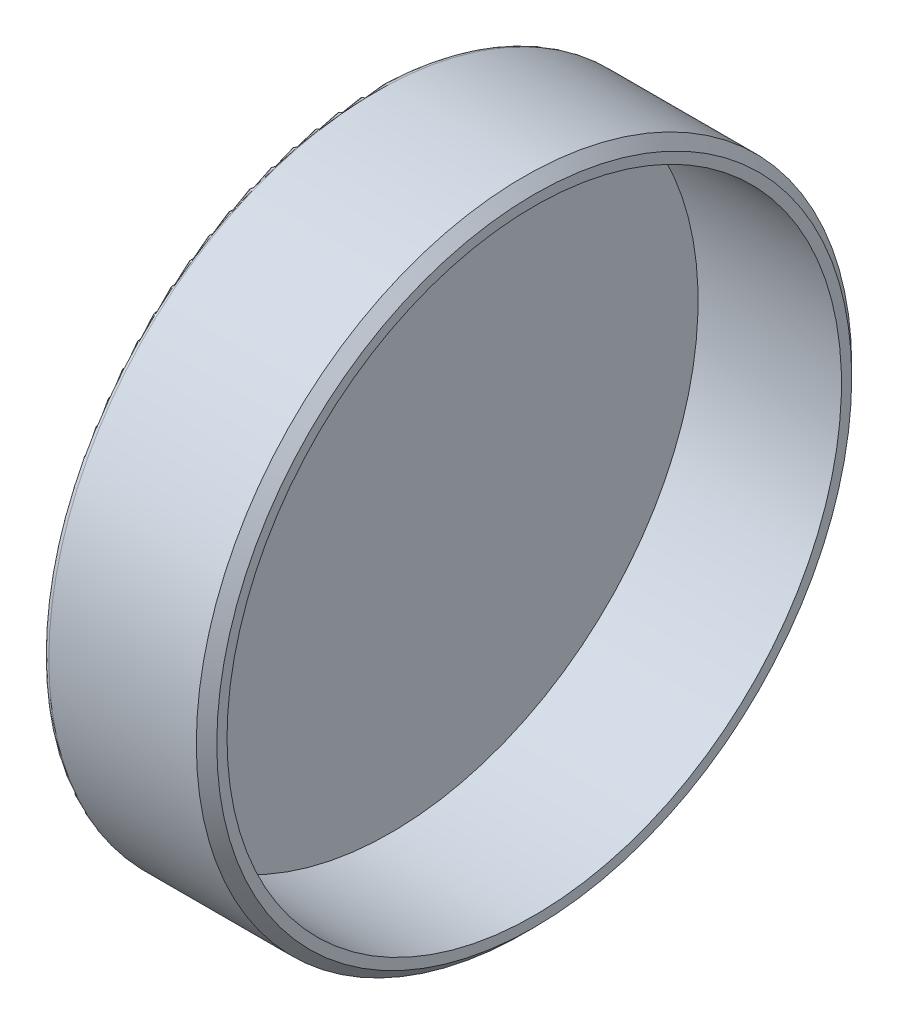
ISO-10303-21;
HEADER;
FILE_DESCRIPTION(('STEP AP214'),'2;1');
FILE_NAME('part.step','',(''),(''),'','','');
FILE_SCHEMA(('AUTOMOTIVE_DESIGN { 1 0 10303 214 1 1 1 1 }'));
ENDSEC;
DATA;
#1=APPLICATION_CONTEXT('core data for automotive mechanical design processes');
#2=APPLICATION_PROTOCOL_DEFINITION('international standard','automotive_design',2000,#1);
#3=PRODUCT_CONTEXT('',#1,'mechanical');
#4=PRODUCT('Part','Part','',(#3));
#5=PRODUCT_RELATED_PRODUCT_CATEGORY('part','',(#4));
#6=PRODUCT_DEFINITION_FORMATION('','',#4);
#7=PRODUCT_DEFINITION_CONTEXT('part definition',#1,'design');
#8=PRODUCT_DEFINITION('design','',#6,#7);
#9=PRODUCT_DEFINITION_SHAPE('','',#8);
#10=(LENGTH_UNIT() NAMED_UNIT(*) SI_UNIT(.MILLI.,.METRE.));
#11=(NAMED_UNIT(*) PLANE_ANGLE_UNIT() SI_UNIT($,.RADIAN.));
#12=(NAMED_UNIT(*) SI_UNIT($,.STERADIAN.) SOLID_ANGLE_UNIT());
#13=UNCERTAINTY_MEASURE_WITH_UNIT(LENGTH_MEASURE(1.E-05),#10,'distance_accuracy_value','');
#14=(GEOMETRIC_REPRESENTATION_CONTEXT(3) GLOBAL_UNCERTAINTY_ASSIGNED_CONTEXT((#13)) GLOBAL_UNIT_ASSIGNED_CONTEXT((#10,
#11,#12)) REPRESENTATION_CONTEXT('',''));
#15=CARTESIAN_POINT('',(0.,0.,0.));
#16=DIRECTION('',(0.,0.,1.));
#17=DIRECTION('',(1.,0.,0.));
#18=AXIS2_PLACEMENT_3D('',#15,#16,#17);
#19=CARTESIAN_POINT('',(-7.89265536723163,0.,0.));
#20=DIRECTION('',(-1.,0.,0.));
#21=DIRECTION('',(0.,0.,1.));
#22=AXIS2_PLACEMENT_3D('',#19,#20,#21);
#23=CYLINDRICAL_SURFACE('',#22,15.);
#24=CARTESIAN_POINT('',(8.,0.,0.));
#25=DIRECTION('',(-1.,0.,0.));
#26=DIRECTION('',(0.,0.,1.));
#27=AXIS2_PLACEMENT_3D('',#24,#25,#26);
#28=CIRCLE('',#27,15.);
#29=CARTESIAN_POINT('',(8.,0.,15.));
#30=VERTEX_POINT('',#29);
#31=EDGE_CURVE('E52',#30,#30,#28,.T.);
#32=ORIENTED_EDGE('',*,*,#31,.F.);
#33=EDGE_LOOP('',(#32));
#34=FACE_BOUND('',#33,.T.);
#35=CARTESIAN_POINT('',(1.,0.,0.));
#36=DIRECTION('',(-1.,0.,0.));
#37=DIRECTION('',(0.,0.,1.));
#38=AXIS2_PLACEMENT_3D('',#35,#36,#37);
#39=CIRCLE('',#38,15.);
#40=CARTESIAN_POINT('',(1.,0.,15.));
#41=VERTEX_POINT('',#40);
#42=EDGE_CURVE('E49',#41,#41,#39,.T.);
#43=ORIENTED_EDGE('',*,*,#42,.T.);
#44=EDGE_LOOP('',(#43));
#45=FACE_BOUND('',#44,.T.);
#46=ADVANCED_FACE('F30',(#34,#45),#23,.F.);
#47=CARTESIAN_POINT('',(1.,0.,0.));
#48=DIRECTION('',(-1.,0.,0.));
#49=DIRECTION('',(0.,0.,1.));
#50=AXIS2_PLACEMENT_3D('',#47,#48,#49);
#51=PLANE('',#50);
#52=ORIENTED_EDGE('',*,*,#42,.F.);
#53=EDGE_LOOP('',(#52));
#54=FACE_BOUND('',#53,.T.);
#55=ADVANCED_FACE('F60',(#54),#51,.F.);
#56=CARTESIAN_POINT('',(0.,0.,0.));
#57=DIRECTION('',(-1.,0.,0.));
#58=DIRECTION('',(0.,0.,1.));
#59=AXIS2_PLACEMENT_3D('',#56,#57,#58);
#60=PLANE('',#59);
#61=CARTESIAN_POINT('',(0.,0.,0.));
#62=DIRECTION('',(-1.,0.,0.));
#63=DIRECTION('',(0.,0.,1.));
#64=AXIS2_PLACEMENT_3D('',#61,#62,#63);
#65=CIRCLE('',#64,15.7);
#66=CARTESIAN_POINT('',(0.,0.,15.7));
#67=VERTEX_POINT('',#66);
#68=EDGE_CURVE('E36',#67,#67,#65,.T.);
#69=ORIENTED_EDGE('',*,*,#68,.T.);
#70=EDGE_LOOP('',(#69));
#71=FACE_BOUND('',#70,.T.);
#72=ADVANCED_FACE('F64',(#71),#60,.T.);
#73=CARTESIAN_POINT('',(-7.89265536723163,0.,0.));
#74=DIRECTION('',(-1.,0.,0.));
#75=DIRECTION('',(0.,0.,1.));
#76=AXIS2_PLACEMENT_3D('',#73,#74,#75);
#77=CYLINDRICAL_SURFACE('',#76,16.);
#78=CARTESIAN_POINT('',(0.3,0.,0.));
#79=DIRECTION('',(-1.,0.,0.));
#80=DIRECTION('',(0.,0.,1.));
#81=AXIS2_PLACEMENT_3D('',#78,#79,#80);
#82=CIRCLE('',#81,16.);
#83=CARTESIAN_POINT('',(0.3,0.,16.));
#84=VERTEX_POINT('',#83);
#85=EDGE_CURVE('E10',#84,#84,#82,.F.);
#86=ORIENTED_EDGE('',*,*,#85,.T.);
#87=EDGE_LOOP('',(#86));
#88=FACE_BOUND('',#87,.T.);
#89=CARTESIAN_POINT('',(7.5,0.,0.));
#90=DIRECTION('',(1.,0.,0.));
#91=DIRECTION('',(0.,0.,-1.));
#92=AXIS2_PLACEMENT_3D('',#89,#90,#91);
#93=CIRCLE('',#92,16.);
#94=CARTESIAN_POINT('',(7.5,0.,-16.));
#95=VERTEX_POINT('',#94);
#96=EDGE_CURVE('E44',#95,#95,#93,.F.);
#97=ORIENTED_EDGE('',*,*,#96,.T.);
#98=EDGE_LOOP('',(#97));
#99=FACE_BOUND('',#98,.T.);
#100=ADVANCED_FACE('F68',(#88,#99),#77,.T.);
#101=CARTESIAN_POINT('',(8.,16.,0.));
#102=DIRECTION('',(1.,0.,0.));
#103=DIRECTION('',(0.,0.,-1.));
#104=AXIS2_PLACEMENT_3D('',#101,#102,#103);
#105=PLANE('',#104);
#106=CARTESIAN_POINT('',(8.,0.,0.));
#107=DIRECTION('',(1.,0.,0.));
#108=DIRECTION('',(0.,0.,-1.));
#109=AXIS2_PLACEMENT_3D('',#106,#107,#108);
#110=CIRCLE('',#109,15.5);
#111=CARTESIAN_POINT('',(8.,0.,-15.5));
#112=VERTEX_POINT('',#111);
#113=EDGE_CURVE('E40',#112,#112,#110,.T.);
#114=ORIENTED_EDGE('',*,*,#113,.T.);
#115=EDGE_LOOP('',(#114));
#116=FACE_BOUND('',#115,.T.);
#117=ORIENTED_EDGE('',*,*,#31,.T.);
#118=EDGE_LOOP('',(#117));
#119=FACE_BOUND('',#118,.T.);
#120=ADVANCED_FACE('F56',(#116,#119),#105,.T.);
#121=CARTESIAN_POINT('',(7.5,0.,0.));
#122=DIRECTION('',(-1.,0.,0.));
#123=DIRECTION('',(0.,0.,1.));
#124=AXIS2_PLACEMENT_3D('',#121,#122,#123);
#125=CONICAL_SURFACE('',#124,16.,0.785398163397452);
#126=ORIENTED_EDGE('',*,*,#113,.F.);
#127=EDGE_LOOP('',(#126));
#128=FACE_BOUND('',#127,.T.);
#129=ORIENTED_EDGE('',*,*,#96,.F.);
#130=EDGE_LOOP('',(#129));
#131=FACE_BOUND('',#130,.T.);
#132=ADVANCED_FACE('F75',(#128,#131),#125,.T.);
#133=CARTESIAN_POINT('',(0.3,0.,0.));
#134=DIRECTION('',(-1.,0.,0.));
#135=DIRECTION('',(0.,0.,1.));
#136=AXIS2_PLACEMENT_3D('',#133,#134,#135);
#137=TOROIDAL_SURFACE('',#136,15.7,0.3);
#138=ORIENTED_EDGE('',*,*,#85,.F.);
#139=EDGE_LOOP('',(#138));
#140=FACE_BOUND('',#139,.T.);
#141=ORIENTED_EDGE('',*,*,#68,.F.);
#142=EDGE_LOOP('',(#141));
#143=FACE_BOUND('',#142,.T.);
#144=ADVANCED_FACE('F79',(#140,#143),#137,.T.);
#145=CLOSED_SHELL('',(#46,#55,#72,#100,#120,#132,#144));
#146=MANIFOLD_SOLID_BREP('B2',#145);
#147=ADVANCED_BREP_SHAPE_REPRESENTATION('',(#18,#146),#14);
#148=SHAPE_DEFINITION_REPRESENTATION(#9,#147);
ENDSEC;
END-ISO-10303-21;
